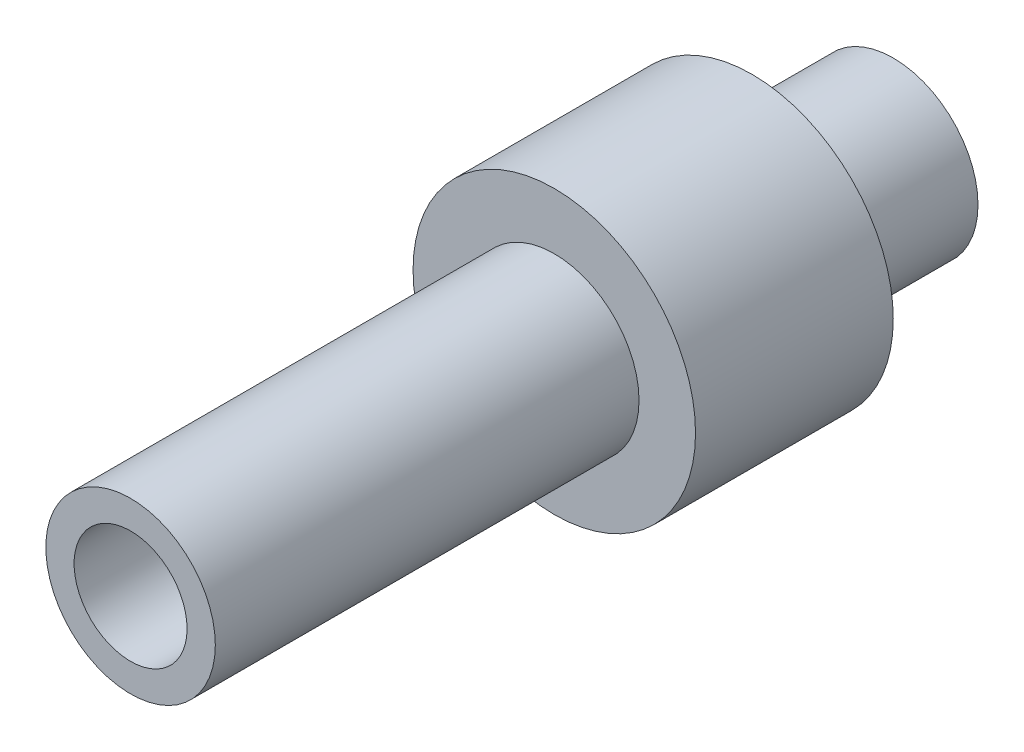
ISO-10303-21;
HEADER;
FILE_DESCRIPTION(('STEP AP214'),'2;1');
FILE_NAME('part.step','',(''),(''),'','','');
FILE_SCHEMA(('AUTOMOTIVE_DESIGN { 1 0 10303 214 1 1 1 1 }'));
ENDSEC;
DATA;
#1=APPLICATION_CONTEXT('core data for automotive mechanical design processes');
#2=APPLICATION_PROTOCOL_DEFINITION('international standard','automotive_design',2000,#1);
#3=PRODUCT_CONTEXT('',#1,'mechanical');
#4=PRODUCT('Part','Part','',(#3));
#5=PRODUCT_RELATED_PRODUCT_CATEGORY('part','',(#4));
#6=PRODUCT_DEFINITION_FORMATION('','',#4);
#7=PRODUCT_DEFINITION_CONTEXT('part definition',#1,'design');
#8=PRODUCT_DEFINITION('design','',#6,#7);
#9=PRODUCT_DEFINITION_SHAPE('','',#8);
#10=(LENGTH_UNIT() NAMED_UNIT(*) SI_UNIT(.MILLI.,.METRE.));
#11=(NAMED_UNIT(*) PLANE_ANGLE_UNIT() SI_UNIT($,.RADIAN.));
#12=(NAMED_UNIT(*) SI_UNIT($,.STERADIAN.) SOLID_ANGLE_UNIT());
#13=UNCERTAINTY_MEASURE_WITH_UNIT(LENGTH_MEASURE(1.E-05),#10,'distance_accuracy_value','');
#14=(GEOMETRIC_REPRESENTATION_CONTEXT(3) GLOBAL_UNCERTAINTY_ASSIGNED_CONTEXT((#13)) GLOBAL_UNIT_ASSIGNED_CONTEXT((#10,
#11,#12)) REPRESENTATION_CONTEXT('',''));
#15=CARTESIAN_POINT('',(0.,0.,0.));
#16=DIRECTION('',(0.,0.,1.));
#17=DIRECTION('',(1.,0.,0.));
#18=AXIS2_PLACEMENT_3D('',#15,#16,#17);
#19=CARTESIAN_POINT('',(0.,0.,0.));
#20=DIRECTION('',(0.,0.,1.));
#21=DIRECTION('',(1.,0.,0.));
#22=AXIS2_PLACEMENT_3D('',#19,#20,#21);
#23=PLANE('',#22);
#24=CARTESIAN_POINT('',(0.,0.,0.));
#25=DIRECTION('',(0.,0.,1.));
#26=DIRECTION('',(1.,0.,0.));
#27=AXIS2_PLACEMENT_3D('',#24,#25,#26);
#28=CIRCLE('',#27,5.);
#29=CARTESIAN_POINT('',(5.,0.,0.));
#30=VERTEX_POINT('',#29);
#31=EDGE_CURVE('E41',#30,#30,#28,.T.);
#32=ORIENTED_EDGE('',*,*,#31,.F.);
#33=EDGE_LOOP('',(#32));
#34=FACE_BOUND('',#33,.T.);
#35=CARTESIAN_POINT('',(0.,0.,0.));
#36=DIRECTION('',(0.,0.,1.));
#37=DIRECTION('',(1.,0.,0.));
#38=AXIS2_PLACEMENT_3D('',#35,#36,#37);
#39=CIRCLE('',#38,3.);
#40=CARTESIAN_POINT('',(3.,0.,0.));
#41=VERTEX_POINT('',#40);
#42=EDGE_CURVE('E10',#41,#41,#39,.F.);
#43=ORIENTED_EDGE('',*,*,#42,.F.);
#44=EDGE_LOOP('',(#43));
#45=FACE_BOUND('',#44,.T.);
#46=ADVANCED_FACE('F30',(#34,#45),#23,.F.);
#47=CARTESIAN_POINT('',(0.,0.,7.));
#48=DIRECTION('',(0.,0.,1.));
#49=DIRECTION('',(1.,0.,0.));
#50=AXIS2_PLACEMENT_3D('',#47,#48,#49);
#51=PLANE('',#50);
#52=CARTESIAN_POINT('',(0.,0.,7.));
#53=DIRECTION('',(0.,0.,1.));
#54=DIRECTION('',(1.,0.,0.));
#55=AXIS2_PLACEMENT_3D('',#52,#53,#54);
#56=CIRCLE('',#55,5.);
#57=CARTESIAN_POINT('',(5.,0.,7.));
#58=VERTEX_POINT('',#57);
#59=EDGE_CURVE('E37',#58,#58,#56,.T.);
#60=ORIENTED_EDGE('',*,*,#59,.T.);
#61=EDGE_LOOP('',(#60));
#62=FACE_BOUND('',#61,.T.);
#63=CARTESIAN_POINT('',(0.,0.,7.));
#64=DIRECTION('',(0.,0.,1.));
#65=DIRECTION('',(1.,0.,0.));
#66=AXIS2_PLACEMENT_3D('',#63,#64,#65);
#67=CIRCLE('',#66,3.);
#68=CARTESIAN_POINT('',(3.,0.,7.));
#69=VERTEX_POINT('',#68);
#70=EDGE_CURVE('E48',#69,#69,#67,.T.);
#71=ORIENTED_EDGE('',*,*,#70,.F.);
#72=EDGE_LOOP('',(#71));
#73=FACE_BOUND('',#72,.T.);
#74=ADVANCED_FACE('F85',(#62,#73),#51,.T.);
#75=CARTESIAN_POINT('',(0.,0.,7.));
#76=DIRECTION('',(0.,0.,-1.));
#77=DIRECTION('',(-1.,0.,0.));
#78=AXIS2_PLACEMENT_3D('',#75,#76,#77);
#79=CYLINDRICAL_SURFACE('',#78,5.);
#80=ORIENTED_EDGE('',*,*,#59,.F.);
#81=EDGE_LOOP('',(#80));
#82=FACE_BOUND('',#81,.T.);
#83=ORIENTED_EDGE('',*,*,#31,.T.);
#84=EDGE_LOOP('',(#83));
#85=FACE_BOUND('',#84,.T.);
#86=ADVANCED_FACE('F32',(#82,#85),#79,.T.);
#87=CARTESIAN_POINT('',(0.,0.,22.));
#88=DIRECTION('',(0.,0.,-1.));
#89=DIRECTION('',(-1.,0.,0.));
#90=AXIS2_PLACEMENT_3D('',#87,#88,#89);
#91=CYLINDRICAL_SURFACE('',#90,3.);
#92=CARTESIAN_POINT('',(0.,0.,22.));
#93=DIRECTION('',(0.,0.,1.));
#94=DIRECTION('',(1.,0.,0.));
#95=AXIS2_PLACEMENT_3D('',#92,#93,#94);
#96=CIRCLE('',#95,3.);
#97=CARTESIAN_POINT('',(3.,0.,22.));
#98=VERTEX_POINT('',#97);
#99=EDGE_CURVE('E46',#98,#98,#96,.T.);
#100=ORIENTED_EDGE('',*,*,#99,.F.);
#101=EDGE_LOOP('',(#100));
#102=FACE_BOUND('',#101,.T.);
#103=ORIENTED_EDGE('',*,*,#70,.T.);
#104=EDGE_LOOP('',(#103));
#105=FACE_BOUND('',#104,.T.);
#106=ADVANCED_FACE('F76',(#102,#105),#91,.T.);
#107=CARTESIAN_POINT('',(0.,0.,22.));
#108=DIRECTION('',(0.,0.,1.));
#109=DIRECTION('',(1.,0.,0.));
#110=AXIS2_PLACEMENT_3D('',#107,#108,#109);
#111=PLANE('',#110);
#112=CARTESIAN_POINT('',(0.,0.,22.));
#113=DIRECTION('',(0.,0.,1.));
#114=DIRECTION('',(1.,0.,0.));
#115=AXIS2_PLACEMENT_3D('',#112,#113,#114);
#116=CIRCLE('',#115,2.);
#117=CARTESIAN_POINT('',(2.,0.,22.));
#118=VERTEX_POINT('',#117);
#119=EDGE_CURVE('E57',#118,#118,#116,.T.);
#120=ORIENTED_EDGE('',*,*,#119,.F.);
#121=EDGE_LOOP('',(#120));
#122=FACE_BOUND('',#121,.T.);
#123=ORIENTED_EDGE('',*,*,#99,.T.);
#124=EDGE_LOOP('',(#123));
#125=FACE_BOUND('',#124,.T.);
#126=ADVANCED_FACE('F72',(#122,#125),#111,.T.);
#127=CARTESIAN_POINT('',(0.,0.,-5.));
#128=DIRECTION('',(0.,0.,1.));
#129=DIRECTION('',(1.,0.,0.));
#130=AXIS2_PLACEMENT_3D('',#127,#128,#129);
#131=CYLINDRICAL_SURFACE('',#130,3.);
#132=CARTESIAN_POINT('',(0.,0.,-5.));
#133=DIRECTION('',(0.,0.,-1.));
#134=DIRECTION('',(-1.,0.,0.));
#135=AXIS2_PLACEMENT_3D('',#132,#133,#134);
#136=CIRCLE('',#135,3.);
#137=CARTESIAN_POINT('',(-3.,0.,-5.));
#138=VERTEX_POINT('',#137);
#139=EDGE_CURVE('E51',#138,#138,#136,.T.);
#140=ORIENTED_EDGE('',*,*,#139,.F.);
#141=EDGE_LOOP('',(#140));
#142=FACE_BOUND('',#141,.T.);
#143=ORIENTED_EDGE('',*,*,#42,.T.);
#144=EDGE_LOOP('',(#143));
#145=FACE_BOUND('',#144,.T.);
#146=ADVANCED_FACE('F75',(#142,#145),#131,.T.);
#147=CARTESIAN_POINT('',(0.,0.,-5.));
#148=DIRECTION('',(0.,0.,-1.));
#149=DIRECTION('',(-1.,0.,0.));
#150=AXIS2_PLACEMENT_3D('',#147,#148,#149);
#151=PLANE('',#150);
#152=CARTESIAN_POINT('',(0.,0.,-5.));
#153=DIRECTION('',(0.,0.,1.));
#154=DIRECTION('',(1.,0.,0.));
#155=AXIS2_PLACEMENT_3D('',#152,#153,#154);
#156=CIRCLE('',#155,2.);
#157=CARTESIAN_POINT('',(2.,0.,-5.));
#158=VERTEX_POINT('',#157);
#159=EDGE_CURVE('E56',#158,#158,#156,.T.);
#160=ORIENTED_EDGE('',*,*,#159,.T.);
#161=EDGE_LOOP('',(#160));
#162=FACE_BOUND('',#161,.T.);
#163=ORIENTED_EDGE('',*,*,#139,.T.);
#164=EDGE_LOOP('',(#163));
#165=FACE_BOUND('',#164,.T.);
#166=ADVANCED_FACE('F63',(#162,#165),#151,.T.);
#167=CARTESIAN_POINT('',(0.,0.,-5.));
#168=DIRECTION('',(0.,0.,1.));
#169=DIRECTION('',(1.,0.,0.));
#170=AXIS2_PLACEMENT_3D('',#167,#168,#169);
#171=CYLINDRICAL_SURFACE('',#170,2.);
#172=ORIENTED_EDGE('',*,*,#159,.F.);
#173=EDGE_LOOP('',(#172));
#174=FACE_BOUND('',#173,.T.);
#175=ORIENTED_EDGE('',*,*,#119,.T.);
#176=EDGE_LOOP('',(#175));
#177=FACE_BOUND('',#176,.T.);
#178=ADVANCED_FACE('F66',(#174,#177),#171,.F.);
#179=CLOSED_SHELL('',(#46,#74,#86,#106,#126,#146,#166,#178));
#180=MANIFOLD_SOLID_BREP('B2',#179);
#181=ADVANCED_BREP_SHAPE_REPRESENTATION('',(#18,#180),#14);
#182=SHAPE_DEFINITION_REPRESENTATION(#9,#181);
ENDSEC;
END-ISO-10303-21;
